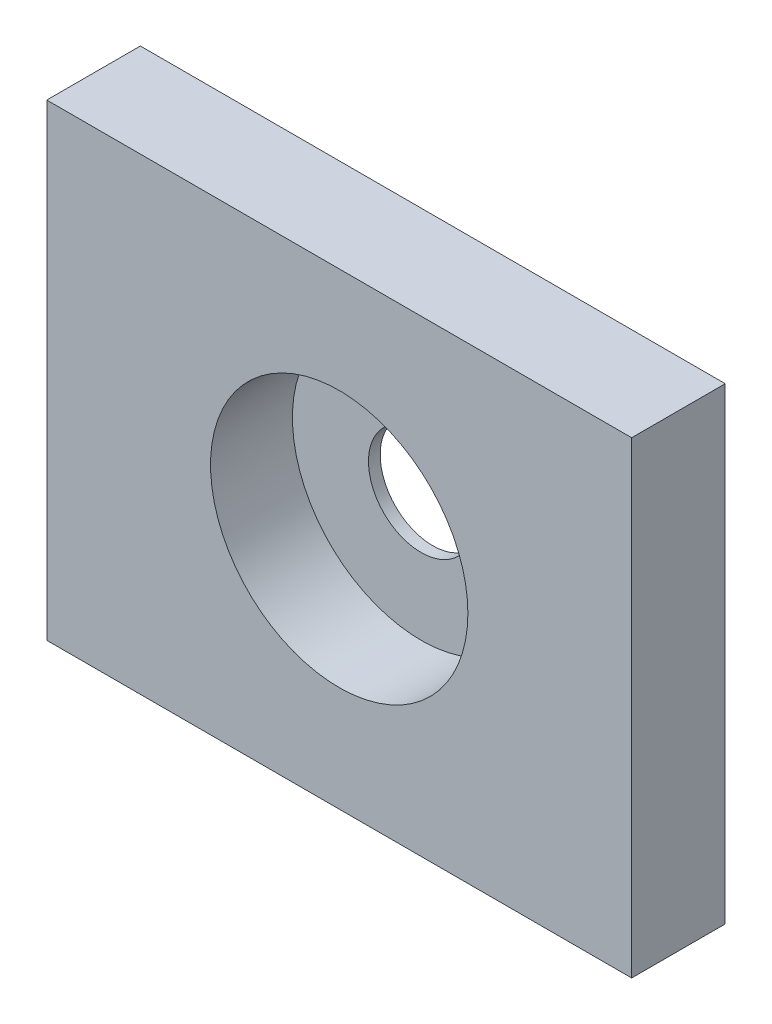
ISO-10303-21;
HEADER;
FILE_DESCRIPTION(('STEP AP214'),'2;1');
FILE_NAME('part.step','',(''),(''),'','','');
FILE_SCHEMA(('AUTOMOTIVE_DESIGN { 1 0 10303 214 1 1 1 1 }'));
ENDSEC;
DATA;
#1=APPLICATION_CONTEXT('core data for automotive mechanical design processes');
#2=APPLICATION_PROTOCOL_DEFINITION('international standard','automotive_design',2000,#1);
#3=PRODUCT_CONTEXT('',#1,'mechanical');
#4=PRODUCT('Part','Part','',(#3));
#5=PRODUCT_RELATED_PRODUCT_CATEGORY('part','',(#4));
#6=PRODUCT_DEFINITION_FORMATION('','',#4);
#7=PRODUCT_DEFINITION_CONTEXT('part definition',#1,'design');
#8=PRODUCT_DEFINITION('design','',#6,#7);
#9=PRODUCT_DEFINITION_SHAPE('','',#8);
#10=(LENGTH_UNIT() NAMED_UNIT(*) SI_UNIT(.MILLI.,.METRE.));
#11=(NAMED_UNIT(*) PLANE_ANGLE_UNIT() SI_UNIT($,.RADIAN.));
#12=(NAMED_UNIT(*) SI_UNIT($,.STERADIAN.) SOLID_ANGLE_UNIT());
#13=UNCERTAINTY_MEASURE_WITH_UNIT(LENGTH_MEASURE(1.E-05),#10,'distance_accuracy_value','');
#14=(GEOMETRIC_REPRESENTATION_CONTEXT(3) GLOBAL_UNCERTAINTY_ASSIGNED_CONTEXT((#13)) GLOBAL_UNIT_ASSIGNED_CONTEXT((#10,
#11,#12)) REPRESENTATION_CONTEXT('',''));
#15=CARTESIAN_POINT('',(0.,0.,0.));
#16=DIRECTION('',(0.,0.,1.));
#17=DIRECTION('',(1.,0.,0.));
#18=AXIS2_PLACEMENT_3D('',#15,#16,#17);
#19=CARTESIAN_POINT('',(25.,20.,8.));
#20=DIRECTION('',(0.,0.,-1.));
#21=DIRECTION('',(-1.,0.,0.));
#22=AXIS2_PLACEMENT_3D('',#19,#20,#21);
#23=CYLINDRICAL_SURFACE('',#22,4.5);
#24=CARTESIAN_POINT('',(25.,20.,0.));
#25=DIRECTION('',(0.,0.,1.));
#26=DIRECTION('',(1.,0.,0.));
#27=AXIS2_PLACEMENT_3D('',#24,#25,#26);
#28=CIRCLE('',#27,4.5);
#29=CARTESIAN_POINT('',(29.5,20.,0.));
#30=VERTEX_POINT('',#29);
#31=EDGE_CURVE('E102',#30,#30,#28,.T.);
#32=ORIENTED_EDGE('',*,*,#31,.F.);
#33=EDGE_LOOP('',(#32));
#34=FACE_BOUND('',#33,.T.);
#35=CARTESIAN_POINT('',(25.,20.,1.));
#36=DIRECTION('',(0.,0.,1.));
#37=DIRECTION('',(1.,0.,0.));
#38=AXIS2_PLACEMENT_3D('',#35,#36,#37);
#39=CIRCLE('',#38,4.5);
#40=CARTESIAN_POINT('',(29.5,20.,1.));
#41=VERTEX_POINT('',#40);
#42=EDGE_CURVE('E37',#41,#41,#39,.T.);
#43=ORIENTED_EDGE('',*,*,#42,.T.);
#44=EDGE_LOOP('',(#43));
#45=FACE_BOUND('',#44,.T.);
#46=ADVANCED_FACE('F33',(#34,#45),#23,.F.);
#47=CARTESIAN_POINT('',(0.,0.,8.));
#48=DIRECTION('',(0.,0.,-1.));
#49=DIRECTION('',(-1.,0.,0.));
#50=AXIS2_PLACEMENT_3D('',#47,#48,#49);
#51=PLANE('',#50);
#52=CARTESIAN_POINT('',(25.,20.,8.));
#53=DIRECTION('',(0.,0.,1.));
#54=DIRECTION('',(1.,0.,0.));
#55=AXIS2_PLACEMENT_3D('',#52,#53,#54);
#56=CIRCLE('',#55,11.);
#57=CARTESIAN_POINT('',(36.,20.,8.));
#58=VERTEX_POINT('',#57);
#59=EDGE_CURVE('E116',#58,#58,#56,.T.);
#60=ORIENTED_EDGE('',*,*,#59,.F.);
#61=EDGE_LOOP('',(#60));
#62=FACE_BOUND('',#61,.T.);
#63=DIRECTION('',(0.,-1.,0.));
#64=VECTOR('',#63,1.);
#65=CARTESIAN_POINT('',(0.,0.,8.));
#66=LINE('',#65,#64);
#67=CARTESIAN_POINT('',(0.,40.,8.));
#68=VERTEX_POINT('',#67);
#69=CARTESIAN_POINT('',(0.,0.,8.));
#70=VERTEX_POINT('',#69);
#71=EDGE_CURVE('E86',#68,#70,#66,.T.);
#72=ORIENTED_EDGE('',*,*,#71,.T.);
#73=DIRECTION('',(1.,0.,0.));
#74=VECTOR('',#73,1.);
#75=CARTESIAN_POINT('',(0.,0.,8.));
#76=LINE('',#75,#74);
#77=CARTESIAN_POINT('',(50.,0.,8.));
#78=VERTEX_POINT('',#77);
#79=EDGE_CURVE('E81',#70,#78,#76,.T.);
#80=ORIENTED_EDGE('',*,*,#79,.T.);
#81=DIRECTION('',(0.,1.,0.));
#82=VECTOR('',#81,1.);
#83=CARTESIAN_POINT('',(50.,0.,8.));
#84=LINE('',#83,#82);
#85=CARTESIAN_POINT('',(50.,40.,8.));
#86=VERTEX_POINT('',#85);
#87=EDGE_CURVE('E84',#78,#86,#84,.T.);
#88=ORIENTED_EDGE('',*,*,#87,.T.);
#89=DIRECTION('',(-1.,0.,0.));
#90=VECTOR('',#89,1.);
#91=CARTESIAN_POINT('',(0.,40.,8.));
#92=LINE('',#91,#90);
#93=EDGE_CURVE('E51',#86,#68,#92,.T.);
#94=ORIENTED_EDGE('',*,*,#93,.T.);
#95=EDGE_LOOP('',(#72,#80,#88,#94));
#96=FACE_BOUND('',#95,.T.);
#97=ADVANCED_FACE('F82',(#62,#96),#51,.F.);
#98=CARTESIAN_POINT('',(0.,0.,0.));
#99=DIRECTION('',(0.,0.,-1.));
#100=DIRECTION('',(-1.,0.,0.));
#101=AXIS2_PLACEMENT_3D('',#98,#99,#100);
#102=PLANE('',#101);
#103=DIRECTION('',(0.,-1.,0.));
#104=VECTOR('',#103,1.);
#105=CARTESIAN_POINT('',(0.,0.,0.));
#106=LINE('',#105,#104);
#107=CARTESIAN_POINT('',(0.,40.,0.));
#108=VERTEX_POINT('',#107);
#109=CARTESIAN_POINT('',(0.,0.,0.));
#110=VERTEX_POINT('',#109);
#111=EDGE_CURVE('E99',#108,#110,#106,.T.);
#112=ORIENTED_EDGE('',*,*,#111,.F.);
#113=DIRECTION('',(-1.,0.,0.));
#114=VECTOR('',#113,1.);
#115=CARTESIAN_POINT('',(0.,40.,0.));
#116=LINE('',#115,#114);
#117=CARTESIAN_POINT('',(50.,40.,0.));
#118=VERTEX_POINT('',#117);
#119=EDGE_CURVE('E74',#118,#108,#116,.T.);
#120=ORIENTED_EDGE('',*,*,#119,.F.);
#121=DIRECTION('',(0.,1.,0.));
#122=VECTOR('',#121,1.);
#123=CARTESIAN_POINT('',(50.,0.,0.));
#124=LINE('',#123,#122);
#125=CARTESIAN_POINT('',(50.,0.,0.));
#126=VERTEX_POINT('',#125);
#127=EDGE_CURVE('E68',#126,#118,#124,.T.);
#128=ORIENTED_EDGE('',*,*,#127,.F.);
#129=DIRECTION('',(1.,0.,0.));
#130=VECTOR('',#129,1.);
#131=CARTESIAN_POINT('',(0.,0.,0.));
#132=LINE('',#131,#130);
#133=EDGE_CURVE('E90',#110,#126,#132,.T.);
#134=ORIENTED_EDGE('',*,*,#133,.F.);
#135=EDGE_LOOP('',(#112,#120,#128,#134));
#136=FACE_BOUND('',#135,.T.);
#137=ORIENTED_EDGE('',*,*,#31,.T.);
#138=EDGE_LOOP('',(#137));
#139=FACE_BOUND('',#138,.T.);
#140=ADVANCED_FACE('F110',(#136,#139),#102,.T.);
#141=CARTESIAN_POINT('',(0.,0.,8.));
#142=DIRECTION('',(1.,0.,0.));
#143=DIRECTION('',(0.,0.,-1.));
#144=AXIS2_PLACEMENT_3D('',#141,#142,#143);
#145=PLANE('',#144);
#146=ORIENTED_EDGE('',*,*,#111,.T.);
#147=DIRECTION('',(0.,0.,-1.));
#148=VECTOR('',#147,1.);
#149=CARTESIAN_POINT('',(0.,0.,8.));
#150=LINE('',#149,#148);
#151=EDGE_CURVE('E11',#70,#110,#150,.T.);
#152=ORIENTED_EDGE('',*,*,#151,.F.);
#153=ORIENTED_EDGE('',*,*,#71,.F.);
#154=DIRECTION('',(0.,0.,-1.));
#155=VECTOR('',#154,1.);
#156=CARTESIAN_POINT('',(0.,40.,8.));
#157=LINE('',#156,#155);
#158=EDGE_CURVE('E95',#68,#108,#157,.T.);
#159=ORIENTED_EDGE('',*,*,#158,.T.);
#160=EDGE_LOOP('',(#146,#152,#153,#159));
#161=FACE_BOUND('',#160,.T.);
#162=ADVANCED_FACE('F35',(#161),#145,.F.);
#163=CARTESIAN_POINT('',(0.,0.,8.));
#164=DIRECTION('',(0.,1.,0.));
#165=DIRECTION('',(0.,0.,1.));
#166=AXIS2_PLACEMENT_3D('',#163,#164,#165);
#167=PLANE('',#166);
#168=ORIENTED_EDGE('',*,*,#133,.T.);
#169=DIRECTION('',(0.,0.,-1.));
#170=VECTOR('',#169,1.);
#171=CARTESIAN_POINT('',(50.,0.,8.));
#172=LINE('',#171,#170);
#173=EDGE_CURVE('E43',#78,#126,#172,.T.);
#174=ORIENTED_EDGE('',*,*,#173,.F.);
#175=ORIENTED_EDGE('',*,*,#79,.F.);
#176=ORIENTED_EDGE('',*,*,#151,.T.);
#177=EDGE_LOOP('',(#168,#174,#175,#176));
#178=FACE_BOUND('',#177,.T.);
#179=ADVANCED_FACE('F89',(#178),#167,.F.);
#180=CARTESIAN_POINT('',(50.,0.,8.));
#181=DIRECTION('',(-1.,0.,0.));
#182=DIRECTION('',(0.,0.,1.));
#183=AXIS2_PLACEMENT_3D('',#180,#181,#182);
#184=PLANE('',#183);
#185=ORIENTED_EDGE('',*,*,#127,.T.);
#186=DIRECTION('',(0.,0.,-1.));
#187=VECTOR('',#186,1.);
#188=CARTESIAN_POINT('',(50.,40.,8.));
#189=LINE('',#188,#187);
#190=EDGE_CURVE('E91',#86,#118,#189,.T.);
#191=ORIENTED_EDGE('',*,*,#190,.F.);
#192=ORIENTED_EDGE('',*,*,#87,.F.);
#193=ORIENTED_EDGE('',*,*,#173,.T.);
#194=EDGE_LOOP('',(#185,#191,#192,#193));
#195=FACE_BOUND('',#194,.T.);
#196=ADVANCED_FACE('F93',(#195),#184,.F.);
#197=CARTESIAN_POINT('',(0.,40.,8.));
#198=DIRECTION('',(0.,-1.,0.));
#199=DIRECTION('',(0.,0.,-1.));
#200=AXIS2_PLACEMENT_3D('',#197,#198,#199);
#201=PLANE('',#200);
#202=ORIENTED_EDGE('',*,*,#119,.T.);
#203=ORIENTED_EDGE('',*,*,#158,.F.);
#204=ORIENTED_EDGE('',*,*,#93,.F.);
#205=ORIENTED_EDGE('',*,*,#190,.T.);
#206=EDGE_LOOP('',(#202,#203,#204,#205));
#207=FACE_BOUND('',#206,.T.);
#208=ADVANCED_FACE('F107',(#207),#201,.F.);
#209=CARTESIAN_POINT('',(25.,20.,1.));
#210=DIRECTION('',(0.,0.,1.));
#211=DIRECTION('',(1.,0.,0.));
#212=AXIS2_PLACEMENT_3D('',#209,#210,#211);
#213=CYLINDRICAL_SURFACE('',#212,11.);
#214=CARTESIAN_POINT('',(25.,20.,1.));
#215=DIRECTION('',(0.,0.,1.));
#216=DIRECTION('',(1.,0.,0.));
#217=AXIS2_PLACEMENT_3D('',#214,#215,#216);
#218=CIRCLE('',#217,11.);
#219=CARTESIAN_POINT('',(36.,20.,1.));
#220=VERTEX_POINT('',#219);
#221=EDGE_CURVE('E119',#220,#220,#218,.T.);
#222=ORIENTED_EDGE('',*,*,#221,.F.);
#223=EDGE_LOOP('',(#222));
#224=FACE_BOUND('',#223,.T.);
#225=ORIENTED_EDGE('',*,*,#59,.T.);
#226=EDGE_LOOP('',(#225));
#227=FACE_BOUND('',#226,.T.);
#228=ADVANCED_FACE('F129',(#224,#227),#213,.F.);
#229=CARTESIAN_POINT('',(25.,20.,1.));
#230=DIRECTION('',(0.,0.,1.));
#231=DIRECTION('',(1.,0.,0.));
#232=AXIS2_PLACEMENT_3D('',#229,#230,#231);
#233=PLANE('',#232);
#234=ORIENTED_EDGE('',*,*,#42,.F.);
#235=EDGE_LOOP('',(#234));
#236=FACE_BOUND('',#235,.T.);
#237=ORIENTED_EDGE('',*,*,#221,.T.);
#238=EDGE_LOOP('',(#237));
#239=FACE_BOUND('',#238,.T.);
#240=ADVANCED_FACE('F127',(#236,#239),#233,.T.);
#241=CLOSED_SHELL('',(#46,#97,#140,#162,#179,#196,#208,#228,#240));
#242=MANIFOLD_SOLID_BREP('B2',#241);
#243=ADVANCED_BREP_SHAPE_REPRESENTATION('',(#18,#242),#14);
#244=SHAPE_DEFINITION_REPRESENTATION(#9,#243);
ENDSEC;
END-ISO-10303-21;
